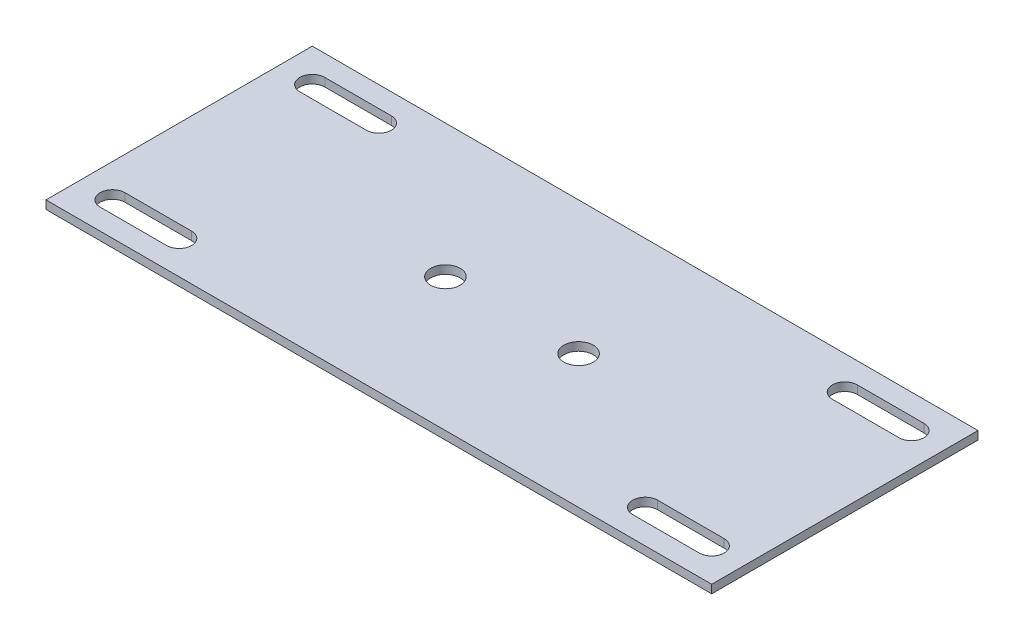
ISO-10303-21;
HEADER;
FILE_DESCRIPTION(('STEP AP214'),'2;1');
FILE_NAME('part.step','',(''),(''),'','','');
FILE_SCHEMA(('AUTOMOTIVE_DESIGN { 1 0 10303 214 1 1 1 1 }'));
ENDSEC;
DATA;
#1=APPLICATION_CONTEXT('core data for automotive mechanical design processes');
#2=APPLICATION_PROTOCOL_DEFINITION('international standard','automotive_design',2000,#1);
#3=PRODUCT_CONTEXT('',#1,'mechanical');
#4=PRODUCT('Part','Part','',(#3));
#5=PRODUCT_RELATED_PRODUCT_CATEGORY('part','',(#4));
#6=PRODUCT_DEFINITION_FORMATION('','',#4);
#7=PRODUCT_DEFINITION_CONTEXT('part definition',#1,'design');
#8=PRODUCT_DEFINITION('design','',#6,#7);
#9=PRODUCT_DEFINITION_SHAPE('','',#8);
#10=(LENGTH_UNIT() NAMED_UNIT(*) SI_UNIT(.MILLI.,.METRE.));
#11=(NAMED_UNIT(*) PLANE_ANGLE_UNIT() SI_UNIT($,.RADIAN.));
#12=(NAMED_UNIT(*) SI_UNIT($,.STERADIAN.) SOLID_ANGLE_UNIT());
#13=UNCERTAINTY_MEASURE_WITH_UNIT(LENGTH_MEASURE(1.E-05),#10,'distance_accuracy_value','');
#14=(GEOMETRIC_REPRESENTATION_CONTEXT(3) GLOBAL_UNCERTAINTY_ASSIGNED_CONTEXT((#13)) GLOBAL_UNIT_ASSIGNED_CONTEXT((#10,
#11,#12)) REPRESENTATION_CONTEXT('',''));
#15=CARTESIAN_POINT('',(0.,0.,0.));
#16=DIRECTION('',(0.,0.,1.));
#17=DIRECTION('',(1.,0.,0.));
#18=AXIS2_PLACEMENT_3D('',#15,#16,#17);
#19=CARTESIAN_POINT('',(63.5,1.5875,25.4));
#20=DIRECTION('',(-1.,0.,0.));
#21=DIRECTION('',(0.,0.,1.));
#22=AXIS2_PLACEMENT_3D('',#19,#20,#21);
#23=PLANE('',#22);
#24=DIRECTION('',(0.,0.,-1.));
#25=VECTOR('',#24,1.);
#26=CARTESIAN_POINT('',(63.5,0.,25.4));
#27=LINE('',#26,#25);
#28=CARTESIAN_POINT('',(63.5,0.,25.4));
#29=VERTEX_POINT('',#28);
#30=CARTESIAN_POINT('',(63.5,0.,-25.4));
#31=VERTEX_POINT('',#30);
#32=EDGE_CURVE('E302',#29,#31,#27,.T.);
#33=ORIENTED_EDGE('',*,*,#32,.T.);
#34=DIRECTION('',(0.,-1.,0.));
#35=VECTOR('',#34,1.);
#36=CARTESIAN_POINT('',(63.5,1.5875,-25.4));
#37=LINE('',#36,#35);
#38=CARTESIAN_POINT('',(63.5,1.5875,-25.4));
#39=VERTEX_POINT('',#38);
#40=EDGE_CURVE('E11',#39,#31,#37,.T.);
#41=ORIENTED_EDGE('',*,*,#40,.F.);
#42=DIRECTION('',(0.,0.,-1.));
#43=VECTOR('',#42,1.);
#44=CARTESIAN_POINT('',(63.5,1.5875,25.4));
#45=LINE('',#44,#43);
#46=CARTESIAN_POINT('',(63.5,1.5875,25.4));
#47=VERTEX_POINT('',#46);
#48=EDGE_CURVE('E309',#47,#39,#45,.T.);
#49=ORIENTED_EDGE('',*,*,#48,.F.);
#50=DIRECTION('',(0.,-1.,0.));
#51=VECTOR('',#50,1.);
#52=CARTESIAN_POINT('',(63.5,1.5875,25.4));
#53=LINE('',#52,#51);
#54=EDGE_CURVE('E319',#47,#29,#53,.T.);
#55=ORIENTED_EDGE('',*,*,#54,.T.);
#56=EDGE_LOOP('',(#33,#41,#49,#55));
#57=FACE_BOUND('',#56,.T.);
#58=ADVANCED_FACE('F37',(#57),#23,.F.);
#59=CARTESIAN_POINT('',(-63.5,1.5875,-25.4));
#60=DIRECTION('',(0.,0.,1.));
#61=DIRECTION('',(1.,0.,0.));
#62=AXIS2_PLACEMENT_3D('',#59,#60,#61);
#63=PLANE('',#62);
#64=DIRECTION('',(-1.,0.,0.));
#65=VECTOR('',#64,1.);
#66=CARTESIAN_POINT('',(-63.5,0.,-25.4));
#67=LINE('',#66,#65);
#68=CARTESIAN_POINT('',(-63.5,0.,-25.4));
#69=VERTEX_POINT('',#68);
#70=EDGE_CURVE('E322',#31,#69,#67,.T.);
#71=ORIENTED_EDGE('',*,*,#70,.T.);
#72=DIRECTION('',(0.,-1.,0.));
#73=VECTOR('',#72,1.);
#74=CARTESIAN_POINT('',(-63.5,1.5875,-25.4));
#75=LINE('',#74,#73);
#76=CARTESIAN_POINT('',(-63.5,1.5875,-25.4));
#77=VERTEX_POINT('',#76);
#78=EDGE_CURVE('E44',#77,#69,#75,.T.);
#79=ORIENTED_EDGE('',*,*,#78,.F.);
#80=DIRECTION('',(-1.,0.,0.));
#81=VECTOR('',#80,1.);
#82=CARTESIAN_POINT('',(-63.5,1.5875,-25.4));
#83=LINE('',#82,#81);
#84=EDGE_CURVE('E312',#39,#77,#83,.T.);
#85=ORIENTED_EDGE('',*,*,#84,.F.);
#86=ORIENTED_EDGE('',*,*,#40,.T.);
#87=EDGE_LOOP('',(#71,#79,#85,#86));
#88=FACE_BOUND('',#87,.T.);
#89=ADVANCED_FACE('F351',(#88),#63,.F.);
#90=CARTESIAN_POINT('',(-63.5,1.5875,25.4));
#91=DIRECTION('',(1.,0.,0.));
#92=DIRECTION('',(0.,0.,-1.));
#93=AXIS2_PLACEMENT_3D('',#90,#91,#92);
#94=PLANE('',#93);
#95=DIRECTION('',(0.,0.,1.));
#96=VECTOR('',#95,1.);
#97=CARTESIAN_POINT('',(-63.5,0.,25.4));
#98=LINE('',#97,#96);
#99=CARTESIAN_POINT('',(-63.5,0.,25.4));
#100=VERTEX_POINT('',#99);
#101=EDGE_CURVE('E324',#69,#100,#98,.T.);
#102=ORIENTED_EDGE('',*,*,#101,.T.);
#103=DIRECTION('',(0.,-1.,0.));
#104=VECTOR('',#103,1.);
#105=CARTESIAN_POINT('',(-63.5,1.5875,25.4));
#106=LINE('',#105,#104);
#107=CARTESIAN_POINT('',(-63.5,1.5875,25.4));
#108=VERTEX_POINT('',#107);
#109=EDGE_CURVE('E329',#108,#100,#106,.T.);
#110=ORIENTED_EDGE('',*,*,#109,.F.);
#111=DIRECTION('',(0.,0.,1.));
#112=VECTOR('',#111,1.);
#113=CARTESIAN_POINT('',(-63.5,1.5875,25.4));
#114=LINE('',#113,#112);
#115=EDGE_CURVE('E315',#77,#108,#114,.T.);
#116=ORIENTED_EDGE('',*,*,#115,.F.);
#117=ORIENTED_EDGE('',*,*,#78,.T.);
#118=EDGE_LOOP('',(#102,#110,#116,#117));
#119=FACE_BOUND('',#118,.T.);
#120=ADVANCED_FACE('F336',(#119),#94,.F.);
#121=CARTESIAN_POINT('',(-63.5,1.5875,25.4));
#122=DIRECTION('',(0.,0.,-1.));
#123=DIRECTION('',(-1.,0.,0.));
#124=AXIS2_PLACEMENT_3D('',#121,#122,#123);
#125=PLANE('',#124);
#126=DIRECTION('',(1.,0.,0.));
#127=VECTOR('',#126,1.);
#128=CARTESIAN_POINT('',(-63.5,0.,25.4));
#129=LINE('',#128,#127);
#130=EDGE_CURVE('E313',#100,#29,#129,.T.);
#131=ORIENTED_EDGE('',*,*,#130,.T.);
#132=ORIENTED_EDGE('',*,*,#54,.F.);
#133=DIRECTION('',(1.,0.,0.));
#134=VECTOR('',#133,1.);
#135=CARTESIAN_POINT('',(-63.5,1.5875,25.4));
#136=LINE('',#135,#134);
#137=EDGE_CURVE('E317',#108,#47,#136,.T.);
#138=ORIENTED_EDGE('',*,*,#137,.F.);
#139=ORIENTED_EDGE('',*,*,#109,.T.);
#140=EDGE_LOOP('',(#131,#132,#138,#139));
#141=FACE_BOUND('',#140,.T.);
#142=ADVANCED_FACE('F344',(#141),#125,.F.);
#143=CARTESIAN_POINT('',(0.,1.5875,0.));
#144=DIRECTION('',(0.,-1.,0.));
#145=DIRECTION('',(0.,0.,-1.));
#146=AXIS2_PLACEMENT_3D('',#143,#144,#145);
#147=PLANE('',#146);
#148=CARTESIAN_POINT('',(-12.7,1.5875,0.));
#149=DIRECTION('',(0.,1.,0.));
#150=DIRECTION('',(0.,0.,1.));
#151=AXIS2_PLACEMENT_3D('',#148,#149,#150);
#152=CIRCLE('',#151,2.8067);
#153=CARTESIAN_POINT('',(-12.7,1.5875,2.8067));
#154=VERTEX_POINT('',#153);
#155=EDGE_CURVE('E441',#154,#154,#152,.T.);
#156=ORIENTED_EDGE('',*,*,#155,.F.);
#157=EDGE_LOOP('',(#156));
#158=FACE_BOUND('',#157,.T.);
#159=CARTESIAN_POINT('',(12.7,1.5875,0.));
#160=DIRECTION('',(0.,1.,0.));
#161=DIRECTION('',(0.,0.,1.));
#162=AXIS2_PLACEMENT_3D('',#159,#160,#161);
#163=CIRCLE('',#162,2.8067);
#164=CARTESIAN_POINT('',(12.7,1.5875,2.8067));
#165=VERTEX_POINT('',#164);
#166=EDGE_CURVE('E443',#165,#165,#163,.T.);
#167=ORIENTED_EDGE('',*,*,#166,.F.);
#168=EDGE_LOOP('',(#167));
#169=FACE_BOUND('',#168,.T.);
#170=DIRECTION('',(1.,0.,0.));
#171=VECTOR('',#170,1.);
#172=CARTESIAN_POINT('',(44.45,1.5875,21.43125));
#173=LINE('',#172,#171);
#174=CARTESIAN_POINT('',(44.45,1.5875,21.43125));
#175=VERTEX_POINT('',#174);
#176=CARTESIAN_POINT('',(57.15,1.5875,21.43125));
#177=VERTEX_POINT('',#176);
#178=EDGE_CURVE('E203',#175,#177,#173,.T.);
#179=ORIENTED_EDGE('',*,*,#178,.F.);
#180=CARTESIAN_POINT('',(44.45,1.5875,19.05));
#181=DIRECTION('',(0.,1.,0.));
#182=DIRECTION('',(0.,0.,1.));
#183=AXIS2_PLACEMENT_3D('',#180,#181,#182);
#184=CIRCLE('',#183,2.38125);
#185=CARTESIAN_POINT('',(44.45,1.5875,16.66875));
#186=VERTEX_POINT('',#185);
#187=EDGE_CURVE('E51',#186,#175,#184,.T.);
#188=ORIENTED_EDGE('',*,*,#187,.F.);
#189=DIRECTION('',(-1.,0.,0.));
#190=VECTOR('',#189,1.);
#191=CARTESIAN_POINT('',(44.45,1.5875,16.66875));
#192=LINE('',#191,#190);
#193=CARTESIAN_POINT('',(57.15,1.5875,16.66875));
#194=VERTEX_POINT('',#193);
#195=EDGE_CURVE('E191',#194,#186,#192,.T.);
#196=ORIENTED_EDGE('',*,*,#195,.F.);
#197=CARTESIAN_POINT('',(57.15,1.5875,19.05));
#198=DIRECTION('',(0.,1.,0.));
#199=DIRECTION('',(0.,0.,1.));
#200=AXIS2_PLACEMENT_3D('',#197,#198,#199);
#201=CIRCLE('',#200,2.38125);
#202=EDGE_CURVE('E194',#177,#194,#201,.T.);
#203=ORIENTED_EDGE('',*,*,#202,.F.);
#204=EDGE_LOOP('',(#179,#188,#196,#203));
#205=FACE_BOUND('',#204,.T.);
#206=DIRECTION('',(1.,0.,0.));
#207=VECTOR('',#206,1.);
#208=CARTESIAN_POINT('',(44.45,1.5875,-16.66875));
#209=LINE('',#208,#207);
#210=CARTESIAN_POINT('',(44.45,1.5875,-16.66875));
#211=VERTEX_POINT('',#210);
#212=CARTESIAN_POINT('',(57.15,1.5875,-16.66875));
#213=VERTEX_POINT('',#212);
#214=EDGE_CURVE('E228',#211,#213,#209,.T.);
#215=ORIENTED_EDGE('',*,*,#214,.F.);
#216=CARTESIAN_POINT('',(44.45,1.5875,-19.05));
#217=DIRECTION('',(0.,1.,0.));
#218=DIRECTION('',(0.,0.,1.));
#219=AXIS2_PLACEMENT_3D('',#216,#217,#218);
#220=CIRCLE('',#219,2.38125);
#221=CARTESIAN_POINT('',(44.45,1.5875,-21.43125));
#222=VERTEX_POINT('',#221);
#223=EDGE_CURVE('E209',#222,#211,#220,.T.);
#224=ORIENTED_EDGE('',*,*,#223,.F.);
#225=DIRECTION('',(-1.,0.,0.));
#226=VECTOR('',#225,1.);
#227=CARTESIAN_POINT('',(44.45,1.5875,-21.43125));
#228=LINE('',#227,#226);
#229=CARTESIAN_POINT('',(57.15,1.5875,-21.43125));
#230=VERTEX_POINT('',#229);
#231=EDGE_CURVE('E217',#230,#222,#228,.T.);
#232=ORIENTED_EDGE('',*,*,#231,.F.);
#233=CARTESIAN_POINT('',(57.15,1.5875,-19.05));
#234=DIRECTION('',(0.,1.,0.));
#235=DIRECTION('',(0.,0.,1.));
#236=AXIS2_PLACEMENT_3D('',#233,#234,#235);
#237=CIRCLE('',#236,2.38125);
#238=EDGE_CURVE('E231',#213,#230,#237,.T.);
#239=ORIENTED_EDGE('',*,*,#238,.F.);
#240=EDGE_LOOP('',(#215,#224,#232,#239));
#241=FACE_BOUND('',#240,.T.);
#242=DIRECTION('',(1.,0.,0.));
#243=VECTOR('',#242,1.);
#244=CARTESIAN_POINT('',(-57.15,1.5875,21.43125));
#245=LINE('',#244,#243);
#246=CARTESIAN_POINT('',(-57.15,1.5875,21.43125));
#247=VERTEX_POINT('',#246);
#248=CARTESIAN_POINT('',(-44.45,1.5875,21.43125));
#249=VERTEX_POINT('',#248);
#250=EDGE_CURVE('E260',#247,#249,#245,.T.);
#251=ORIENTED_EDGE('',*,*,#250,.F.);
#252=CARTESIAN_POINT('',(-57.15,1.5875,19.05));
#253=DIRECTION('',(0.,1.,0.));
#254=DIRECTION('',(0.,0.,1.));
#255=AXIS2_PLACEMENT_3D('',#252,#253,#254);
#256=CIRCLE('',#255,2.38125);
#257=CARTESIAN_POINT('',(-57.15,1.5875,16.66875));
#258=VERTEX_POINT('',#257);
#259=EDGE_CURVE('E238',#258,#247,#256,.T.);
#260=ORIENTED_EDGE('',*,*,#259,.F.);
#261=DIRECTION('',(-1.,0.,0.));
#262=VECTOR('',#261,1.);
#263=CARTESIAN_POINT('',(-57.15,1.5875,16.66875));
#264=LINE('',#263,#262);
#265=CARTESIAN_POINT('',(-44.45,1.5875,16.66875));
#266=VERTEX_POINT('',#265);
#267=EDGE_CURVE('E249',#266,#258,#264,.T.);
#268=ORIENTED_EDGE('',*,*,#267,.F.);
#269=CARTESIAN_POINT('',(-44.45,1.5875,19.05));
#270=DIRECTION('',(0.,1.,0.));
#271=DIRECTION('',(0.,0.,1.));
#272=AXIS2_PLACEMENT_3D('',#269,#270,#271);
#273=CIRCLE('',#272,2.38125);
#274=EDGE_CURVE('E263',#249,#266,#273,.T.);
#275=ORIENTED_EDGE('',*,*,#274,.F.);
#276=EDGE_LOOP('',(#251,#260,#268,#275));
#277=FACE_BOUND('',#276,.T.);
#278=DIRECTION('',(1.,0.,0.));
#279=VECTOR('',#278,1.);
#280=CARTESIAN_POINT('',(-57.15,1.5875,-16.66875));
#281=LINE('',#280,#279);
#282=CARTESIAN_POINT('',(-57.15,1.5875,-16.66875));
#283=VERTEX_POINT('',#282);
#284=CARTESIAN_POINT('',(-44.45,1.5875,-16.66875));
#285=VERTEX_POINT('',#284);
#286=EDGE_CURVE('E292',#283,#285,#281,.T.);
#287=ORIENTED_EDGE('',*,*,#286,.F.);
#288=CARTESIAN_POINT('',(-57.15,1.5875,-19.05));
#289=DIRECTION('',(0.,1.,0.));
#290=DIRECTION('',(0.,0.,1.));
#291=AXIS2_PLACEMENT_3D('',#288,#289,#290);
#292=CIRCLE('',#291,2.38125);
#293=CARTESIAN_POINT('',(-57.15,1.5875,-21.43125));
#294=VERTEX_POINT('',#293);
#295=EDGE_CURVE('E270',#294,#283,#292,.T.);
#296=ORIENTED_EDGE('',*,*,#295,.F.);
#297=DIRECTION('',(-1.,0.,0.));
#298=VECTOR('',#297,1.);
#299=CARTESIAN_POINT('',(-57.15,1.5875,-21.43125));
#300=LINE('',#299,#298);
#301=CARTESIAN_POINT('',(-44.45,1.5875,-21.43125));
#302=VERTEX_POINT('',#301);
#303=EDGE_CURVE('E281',#302,#294,#300,.T.);
#304=ORIENTED_EDGE('',*,*,#303,.F.);
#305=CARTESIAN_POINT('',(-44.45,1.5875,-19.05));
#306=DIRECTION('',(0.,1.,0.));
#307=DIRECTION('',(0.,0.,1.));
#308=AXIS2_PLACEMENT_3D('',#305,#306,#307);
#309=CIRCLE('',#308,2.38125);
#310=EDGE_CURVE('E295',#285,#302,#309,.T.);
#311=ORIENTED_EDGE('',*,*,#310,.F.);
#312=EDGE_LOOP('',(#287,#296,#304,#311));
#313=FACE_BOUND('',#312,.T.);
#314=ORIENTED_EDGE('',*,*,#48,.T.);
#315=ORIENTED_EDGE('',*,*,#84,.T.);
#316=ORIENTED_EDGE('',*,*,#115,.T.);
#317=ORIENTED_EDGE('',*,*,#137,.T.);
#318=EDGE_LOOP('',(#314,#315,#316,#317));
#319=FACE_BOUND('',#318,.T.);
#320=ADVANCED_FACE('F350',(#158,#169,#205,#241,#277,#313,#319),#147,.F.);
#321=CARTESIAN_POINT('',(0.,0.,0.));
#322=DIRECTION('',(0.,-1.,0.));
#323=DIRECTION('',(0.,0.,-1.));
#324=AXIS2_PLACEMENT_3D('',#321,#322,#323);
#325=PLANE('',#324);
#326=CARTESIAN_POINT('',(-12.7,0.,0.));
#327=DIRECTION('',(0.,1.,0.));
#328=DIRECTION('',(0.,0.,1.));
#329=AXIS2_PLACEMENT_3D('',#326,#327,#328);
#330=CIRCLE('',#329,2.8067);
#331=CARTESIAN_POINT('',(-12.7,0.,2.8067));
#332=VERTEX_POINT('',#331);
#333=EDGE_CURVE('E438',#332,#332,#330,.T.);
#334=ORIENTED_EDGE('',*,*,#333,.T.);
#335=EDGE_LOOP('',(#334));
#336=FACE_BOUND('',#335,.T.);
#337=CARTESIAN_POINT('',(12.7,0.,0.));
#338=DIRECTION('',(0.,1.,0.));
#339=DIRECTION('',(0.,0.,1.));
#340=AXIS2_PLACEMENT_3D('',#337,#338,#339);
#341=CIRCLE('',#340,2.8067);
#342=CARTESIAN_POINT('',(12.7,0.,2.8067));
#343=VERTEX_POINT('',#342);
#344=EDGE_CURVE('E197',#343,#343,#341,.T.);
#345=ORIENTED_EDGE('',*,*,#344,.T.);
#346=EDGE_LOOP('',(#345));
#347=FACE_BOUND('',#346,.T.);
#348=CARTESIAN_POINT('',(44.45,0.,19.05));
#349=DIRECTION('',(0.,1.,0.));
#350=DIRECTION('',(0.,0.,1.));
#351=AXIS2_PLACEMENT_3D('',#348,#349,#350);
#352=CIRCLE('',#351,2.38125);
#353=CARTESIAN_POINT('',(44.45,0.,16.66875));
#354=VERTEX_POINT('',#353);
#355=CARTESIAN_POINT('',(44.45,0.,21.43125));
#356=VERTEX_POINT('',#355);
#357=EDGE_CURVE('E175',#354,#356,#352,.T.);
#358=ORIENTED_EDGE('',*,*,#357,.T.);
#359=DIRECTION('',(1.,0.,0.));
#360=VECTOR('',#359,1.);
#361=CARTESIAN_POINT('',(44.45,0.,21.43125));
#362=LINE('',#361,#360);
#363=CARTESIAN_POINT('',(57.15,0.,21.43125));
#364=VERTEX_POINT('',#363);
#365=EDGE_CURVE('E184',#356,#364,#362,.T.);
#366=ORIENTED_EDGE('',*,*,#365,.T.);
#367=CARTESIAN_POINT('',(57.15,0.,19.05));
#368=DIRECTION('',(0.,1.,0.));
#369=DIRECTION('',(0.,0.,1.));
#370=AXIS2_PLACEMENT_3D('',#367,#368,#369);
#371=CIRCLE('',#370,2.38125);
#372=CARTESIAN_POINT('',(57.15,0.,16.66875));
#373=VERTEX_POINT('',#372);
#374=EDGE_CURVE('E59',#364,#373,#371,.T.);
#375=ORIENTED_EDGE('',*,*,#374,.T.);
#376=DIRECTION('',(-1.,0.,0.));
#377=VECTOR('',#376,1.);
#378=CARTESIAN_POINT('',(44.45,0.,16.66875));
#379=LINE('',#378,#377);
#380=EDGE_CURVE('E181',#373,#354,#379,.T.);
#381=ORIENTED_EDGE('',*,*,#380,.T.);
#382=EDGE_LOOP('',(#358,#366,#375,#381));
#383=FACE_BOUND('',#382,.T.);
#384=CARTESIAN_POINT('',(44.45,0.,-19.05));
#385=DIRECTION('',(0.,1.,0.));
#386=DIRECTION('',(0.,0.,1.));
#387=AXIS2_PLACEMENT_3D('',#384,#385,#386);
#388=CIRCLE('',#387,2.38125);
#389=CARTESIAN_POINT('',(44.45,0.,-21.43125));
#390=VERTEX_POINT('',#389);
#391=CARTESIAN_POINT('',(44.45,0.,-16.66875));
#392=VERTEX_POINT('',#391);
#393=EDGE_CURVE('E213',#390,#392,#388,.T.);
#394=ORIENTED_EDGE('',*,*,#393,.T.);
#395=DIRECTION('',(1.,0.,0.));
#396=VECTOR('',#395,1.);
#397=CARTESIAN_POINT('',(44.45,0.,-16.66875));
#398=LINE('',#397,#396);
#399=CARTESIAN_POINT('',(57.15,0.,-16.66875));
#400=VERTEX_POINT('',#399);
#401=EDGE_CURVE('E216',#392,#400,#398,.T.);
#402=ORIENTED_EDGE('',*,*,#401,.T.);
#403=CARTESIAN_POINT('',(57.15,0.,-19.05));
#404=DIRECTION('',(0.,1.,0.));
#405=DIRECTION('',(0.,0.,1.));
#406=AXIS2_PLACEMENT_3D('',#403,#404,#405);
#407=CIRCLE('',#406,2.38125);
#408=CARTESIAN_POINT('',(57.15,0.,-21.43125));
#409=VERTEX_POINT('',#408);
#410=EDGE_CURVE('E220',#400,#409,#407,.T.);
#411=ORIENTED_EDGE('',*,*,#410,.T.);
#412=DIRECTION('',(-1.,0.,0.));
#413=VECTOR('',#412,1.);
#414=CARTESIAN_POINT('',(44.45,0.,-21.43125));
#415=LINE('',#414,#413);
#416=EDGE_CURVE('E223',#409,#390,#415,.T.);
#417=ORIENTED_EDGE('',*,*,#416,.T.);
#418=EDGE_LOOP('',(#394,#402,#411,#417));
#419=FACE_BOUND('',#418,.T.);
#420=CARTESIAN_POINT('',(-57.15,0.,19.05));
#421=DIRECTION('',(0.,1.,0.));
#422=DIRECTION('',(0.,0.,1.));
#423=AXIS2_PLACEMENT_3D('',#420,#421,#422);
#424=CIRCLE('',#423,2.38125);
#425=CARTESIAN_POINT('',(-57.15,0.,16.66875));
#426=VERTEX_POINT('',#425);
#427=CARTESIAN_POINT('',(-57.15,0.,21.43125));
#428=VERTEX_POINT('',#427);
#429=EDGE_CURVE('E245',#426,#428,#424,.T.);
#430=ORIENTED_EDGE('',*,*,#429,.T.);
#431=DIRECTION('',(1.,0.,0.));
#432=VECTOR('',#431,1.);
#433=CARTESIAN_POINT('',(-57.15,0.,21.43125));
#434=LINE('',#433,#432);
#435=CARTESIAN_POINT('',(-44.45,0.,21.43125));
#436=VERTEX_POINT('',#435);
#437=EDGE_CURVE('E248',#428,#436,#434,.T.);
#438=ORIENTED_EDGE('',*,*,#437,.T.);
#439=CARTESIAN_POINT('',(-44.45,0.,19.05));
#440=DIRECTION('',(0.,1.,0.));
#441=DIRECTION('',(0.,0.,1.));
#442=AXIS2_PLACEMENT_3D('',#439,#440,#441);
#443=CIRCLE('',#442,2.38125);
#444=CARTESIAN_POINT('',(-44.45,0.,16.66875));
#445=VERTEX_POINT('',#444);
#446=EDGE_CURVE('E252',#436,#445,#443,.T.);
#447=ORIENTED_EDGE('',*,*,#446,.T.);
#448=DIRECTION('',(-1.,0.,0.));
#449=VECTOR('',#448,1.);
#450=CARTESIAN_POINT('',(-57.15,0.,16.66875));
#451=LINE('',#450,#449);
#452=EDGE_CURVE('E255',#445,#426,#451,.T.);
#453=ORIENTED_EDGE('',*,*,#452,.T.);
#454=EDGE_LOOP('',(#430,#438,#447,#453));
#455=FACE_BOUND('',#454,.T.);
#456=CARTESIAN_POINT('',(-57.15,0.,-19.05));
#457=DIRECTION('',(0.,1.,0.));
#458=DIRECTION('',(0.,0.,1.));
#459=AXIS2_PLACEMENT_3D('',#456,#457,#458);
#460=CIRCLE('',#459,2.38125);
#461=CARTESIAN_POINT('',(-57.15,0.,-21.43125));
#462=VERTEX_POINT('',#461);
#463=CARTESIAN_POINT('',(-57.15,0.,-16.66875));
#464=VERTEX_POINT('',#463);
#465=EDGE_CURVE('E277',#462,#464,#460,.T.);
#466=ORIENTED_EDGE('',*,*,#465,.T.);
#467=DIRECTION('',(1.,0.,0.));
#468=VECTOR('',#467,1.);
#469=CARTESIAN_POINT('',(-57.15,0.,-16.66875));
#470=LINE('',#469,#468);
#471=CARTESIAN_POINT('',(-44.45,0.,-16.66875));
#472=VERTEX_POINT('',#471);
#473=EDGE_CURVE('E280',#464,#472,#470,.T.);
#474=ORIENTED_EDGE('',*,*,#473,.T.);
#475=CARTESIAN_POINT('',(-44.45,0.,-19.05));
#476=DIRECTION('',(0.,1.,0.));
#477=DIRECTION('',(0.,0.,1.));
#478=AXIS2_PLACEMENT_3D('',#475,#476,#477);
#479=CIRCLE('',#478,2.38125);
#480=CARTESIAN_POINT('',(-44.45,0.,-21.43125));
#481=VERTEX_POINT('',#480);
#482=EDGE_CURVE('E284',#472,#481,#479,.T.);
#483=ORIENTED_EDGE('',*,*,#482,.T.);
#484=DIRECTION('',(-1.,0.,0.));
#485=VECTOR('',#484,1.);
#486=CARTESIAN_POINT('',(-57.15,0.,-21.43125));
#487=LINE('',#486,#485);
#488=EDGE_CURVE('E287',#481,#462,#487,.T.);
#489=ORIENTED_EDGE('',*,*,#488,.T.);
#490=EDGE_LOOP('',(#466,#474,#483,#489));
#491=FACE_BOUND('',#490,.T.);
#492=ORIENTED_EDGE('',*,*,#32,.F.);
#493=ORIENTED_EDGE('',*,*,#130,.F.);
#494=ORIENTED_EDGE('',*,*,#101,.F.);
#495=ORIENTED_EDGE('',*,*,#70,.F.);
#496=EDGE_LOOP('',(#492,#493,#494,#495));
#497=FACE_BOUND('',#496,.T.);
#498=ADVANCED_FACE('F188',(#336,#347,#383,#419,#455,#491,#497),#325,.T.);
#499=CARTESIAN_POINT('',(-57.15,0.,-19.05));
#500=DIRECTION('',(0.,1.,0.));
#501=DIRECTION('',(0.,0.,1.));
#502=AXIS2_PLACEMENT_3D('',#499,#500,#501);
#503=CYLINDRICAL_SURFACE('',#502,2.38125);
#504=ORIENTED_EDGE('',*,*,#295,.T.);
#505=DIRECTION('',(0.,1.,0.));
#506=VECTOR('',#505,1.);
#507=CARTESIAN_POINT('',(-57.15,0.,-16.66875));
#508=LINE('',#507,#506);
#509=EDGE_CURVE('E290',#464,#283,#508,.T.);
#510=ORIENTED_EDGE('',*,*,#509,.F.);
#511=ORIENTED_EDGE('',*,*,#465,.F.);
#512=DIRECTION('',(0.,1.,0.));
#513=VECTOR('',#512,1.);
#514=CARTESIAN_POINT('',(-57.15,0.,-21.43125));
#515=LINE('',#514,#513);
#516=EDGE_CURVE('E300',#462,#294,#515,.T.);
#517=ORIENTED_EDGE('',*,*,#516,.T.);
#518=EDGE_LOOP('',(#504,#510,#511,#517));
#519=FACE_BOUND('',#518,.T.);
#520=ADVANCED_FACE('F363',(#519),#503,.F.);
#521=CARTESIAN_POINT('',(-57.15,0.,-21.43125));
#522=DIRECTION('',(0.,0.,-1.));
#523=DIRECTION('',(-1.,0.,0.));
#524=AXIS2_PLACEMENT_3D('',#521,#522,#523);
#525=PLANE('',#524);
#526=ORIENTED_EDGE('',*,*,#303,.T.);
#527=ORIENTED_EDGE('',*,*,#516,.F.);
#528=ORIENTED_EDGE('',*,*,#488,.F.);
#529=DIRECTION('',(0.,1.,0.));
#530=VECTOR('',#529,1.);
#531=CARTESIAN_POINT('',(-44.45,0.,-21.43125));
#532=LINE('',#531,#530);
#533=EDGE_CURVE('E303',#481,#302,#532,.T.);
#534=ORIENTED_EDGE('',*,*,#533,.T.);
#535=EDGE_LOOP('',(#526,#527,#528,#534));
#536=FACE_BOUND('',#535,.T.);
#537=ADVANCED_FACE('F370',(#536),#525,.F.);
#538=CARTESIAN_POINT('',(-44.45,0.,-19.05));
#539=DIRECTION('',(0.,1.,0.));
#540=DIRECTION('',(0.,0.,1.));
#541=AXIS2_PLACEMENT_3D('',#538,#539,#540);
#542=CYLINDRICAL_SURFACE('',#541,2.38125);
#543=ORIENTED_EDGE('',*,*,#310,.T.);
#544=ORIENTED_EDGE('',*,*,#533,.F.);
#545=ORIENTED_EDGE('',*,*,#482,.F.);
#546=DIRECTION('',(0.,1.,0.));
#547=VECTOR('',#546,1.);
#548=CARTESIAN_POINT('',(-44.45,0.,-16.66875));
#549=LINE('',#548,#547);
#550=EDGE_CURVE('E305',#472,#285,#549,.T.);
#551=ORIENTED_EDGE('',*,*,#550,.T.);
#552=EDGE_LOOP('',(#543,#544,#545,#551));
#553=FACE_BOUND('',#552,.T.);
#554=ADVANCED_FACE('F376',(#553),#542,.F.);
#555=CARTESIAN_POINT('',(-57.15,0.,-16.66875));
#556=DIRECTION('',(0.,0.,1.));
#557=DIRECTION('',(1.,0.,0.));
#558=AXIS2_PLACEMENT_3D('',#555,#556,#557);
#559=PLANE('',#558);
#560=ORIENTED_EDGE('',*,*,#286,.T.);
#561=ORIENTED_EDGE('',*,*,#550,.F.);
#562=ORIENTED_EDGE('',*,*,#473,.F.);
#563=ORIENTED_EDGE('',*,*,#509,.T.);
#564=EDGE_LOOP('',(#560,#561,#562,#563));
#565=FACE_BOUND('',#564,.T.);
#566=ADVANCED_FACE('F372',(#565),#559,.F.);
#567=CARTESIAN_POINT('',(-57.15,0.,19.05));
#568=DIRECTION('',(0.,1.,0.));
#569=DIRECTION('',(0.,0.,1.));
#570=AXIS2_PLACEMENT_3D('',#567,#568,#569);
#571=CYLINDRICAL_SURFACE('',#570,2.38125);
#572=ORIENTED_EDGE('',*,*,#259,.T.);
#573=DIRECTION('',(0.,1.,0.));
#574=VECTOR('',#573,1.);
#575=CARTESIAN_POINT('',(-57.15,0.,21.43125));
#576=LINE('',#575,#574);
#577=EDGE_CURVE('E258',#428,#247,#576,.T.);
#578=ORIENTED_EDGE('',*,*,#577,.F.);
#579=ORIENTED_EDGE('',*,*,#429,.F.);
#580=DIRECTION('',(0.,1.,0.));
#581=VECTOR('',#580,1.);
#582=CARTESIAN_POINT('',(-57.15,0.,16.66875));
#583=LINE('',#582,#581);
#584=EDGE_CURVE('E268',#426,#258,#583,.T.);
#585=ORIENTED_EDGE('',*,*,#584,.T.);
#586=EDGE_LOOP('',(#572,#578,#579,#585));
#587=FACE_BOUND('',#586,.T.);
#588=ADVANCED_FACE('F375',(#587),#571,.F.);
#589=CARTESIAN_POINT('',(-57.15,0.,16.66875));
#590=DIRECTION('',(0.,0.,-1.));
#591=DIRECTION('',(-1.,0.,0.));
#592=AXIS2_PLACEMENT_3D('',#589,#590,#591);
#593=PLANE('',#592);
#594=ORIENTED_EDGE('',*,*,#267,.T.);
#595=ORIENTED_EDGE('',*,*,#584,.F.);
#596=ORIENTED_EDGE('',*,*,#452,.F.);
#597=DIRECTION('',(0.,1.,0.));
#598=VECTOR('',#597,1.);
#599=CARTESIAN_POINT('',(-44.45,0.,16.66875));
#600=LINE('',#599,#598);
#601=EDGE_CURVE('E271',#445,#266,#600,.T.);
#602=ORIENTED_EDGE('',*,*,#601,.T.);
#603=EDGE_LOOP('',(#594,#595,#596,#602));
#604=FACE_BOUND('',#603,.T.);
#605=ADVANCED_FACE('F386',(#604),#593,.F.);
#606=CARTESIAN_POINT('',(-44.45,0.,19.05));
#607=DIRECTION('',(0.,1.,0.));
#608=DIRECTION('',(0.,0.,1.));
#609=AXIS2_PLACEMENT_3D('',#606,#607,#608);
#610=CYLINDRICAL_SURFACE('',#609,2.38125);
#611=ORIENTED_EDGE('',*,*,#274,.T.);
#612=ORIENTED_EDGE('',*,*,#601,.F.);
#613=ORIENTED_EDGE('',*,*,#446,.F.);
#614=DIRECTION('',(0.,1.,0.));
#615=VECTOR('',#614,1.);
#616=CARTESIAN_POINT('',(-44.45,0.,21.43125));
#617=LINE('',#616,#615);
#618=EDGE_CURVE('E273',#436,#249,#617,.T.);
#619=ORIENTED_EDGE('',*,*,#618,.T.);
#620=EDGE_LOOP('',(#611,#612,#613,#619));
#621=FACE_BOUND('',#620,.T.);
#622=ADVANCED_FACE('F392',(#621),#610,.F.);
#623=CARTESIAN_POINT('',(-57.15,0.,21.43125));
#624=DIRECTION('',(0.,0.,1.));
#625=DIRECTION('',(1.,0.,0.));
#626=AXIS2_PLACEMENT_3D('',#623,#624,#625);
#627=PLANE('',#626);
#628=ORIENTED_EDGE('',*,*,#250,.T.);
#629=ORIENTED_EDGE('',*,*,#618,.F.);
#630=ORIENTED_EDGE('',*,*,#437,.F.);
#631=ORIENTED_EDGE('',*,*,#577,.T.);
#632=EDGE_LOOP('',(#628,#629,#630,#631));
#633=FACE_BOUND('',#632,.T.);
#634=ADVANCED_FACE('F388',(#633),#627,.F.);
#635=CARTESIAN_POINT('',(44.45,0.,-19.05));
#636=DIRECTION('',(0.,1.,0.));
#637=DIRECTION('',(0.,0.,1.));
#638=AXIS2_PLACEMENT_3D('',#635,#636,#637);
#639=CYLINDRICAL_SURFACE('',#638,2.38125);
#640=ORIENTED_EDGE('',*,*,#223,.T.);
#641=DIRECTION('',(0.,1.,0.));
#642=VECTOR('',#641,1.);
#643=CARTESIAN_POINT('',(44.45,0.,-16.66875));
#644=LINE('',#643,#642);
#645=EDGE_CURVE('E226',#392,#211,#644,.T.);
#646=ORIENTED_EDGE('',*,*,#645,.F.);
#647=ORIENTED_EDGE('',*,*,#393,.F.);
#648=DIRECTION('',(0.,1.,0.));
#649=VECTOR('',#648,1.);
#650=CARTESIAN_POINT('',(44.45,0.,-21.43125));
#651=LINE('',#650,#649);
#652=EDGE_CURVE('E236',#390,#222,#651,.T.);
#653=ORIENTED_EDGE('',*,*,#652,.T.);
#654=EDGE_LOOP('',(#640,#646,#647,#653));
#655=FACE_BOUND('',#654,.T.);
#656=ADVANCED_FACE('F391',(#655),#639,.F.);
#657=CARTESIAN_POINT('',(44.45,0.,-21.43125));
#658=DIRECTION('',(0.,0.,-1.));
#659=DIRECTION('',(-1.,0.,0.));
#660=AXIS2_PLACEMENT_3D('',#657,#658,#659);
#661=PLANE('',#660);
#662=ORIENTED_EDGE('',*,*,#231,.T.);
#663=ORIENTED_EDGE('',*,*,#652,.F.);
#664=ORIENTED_EDGE('',*,*,#416,.F.);
#665=DIRECTION('',(0.,1.,0.));
#666=VECTOR('',#665,1.);
#667=CARTESIAN_POINT('',(57.15,0.,-21.43125));
#668=LINE('',#667,#666);
#669=EDGE_CURVE('E239',#409,#230,#668,.T.);
#670=ORIENTED_EDGE('',*,*,#669,.T.);
#671=EDGE_LOOP('',(#662,#663,#664,#670));
#672=FACE_BOUND('',#671,.T.);
#673=ADVANCED_FACE('F402',(#672),#661,.F.);
#674=CARTESIAN_POINT('',(57.15,0.,-19.05));
#675=DIRECTION('',(0.,1.,0.));
#676=DIRECTION('',(0.,0.,1.));
#677=AXIS2_PLACEMENT_3D('',#674,#675,#676);
#678=CYLINDRICAL_SURFACE('',#677,2.38125);
#679=ORIENTED_EDGE('',*,*,#238,.T.);
#680=ORIENTED_EDGE('',*,*,#669,.F.);
#681=ORIENTED_EDGE('',*,*,#410,.F.);
#682=DIRECTION('',(0.,1.,0.));
#683=VECTOR('',#682,1.);
#684=CARTESIAN_POINT('',(57.15,0.,-16.66875));
#685=LINE('',#684,#683);
#686=EDGE_CURVE('E241',#400,#213,#685,.T.);
#687=ORIENTED_EDGE('',*,*,#686,.T.);
#688=EDGE_LOOP('',(#679,#680,#681,#687));
#689=FACE_BOUND('',#688,.T.);
#690=ADVANCED_FACE('F407',(#689),#678,.F.);
#691=CARTESIAN_POINT('',(44.45,0.,-16.66875));
#692=DIRECTION('',(0.,0.,1.));
#693=DIRECTION('',(1.,0.,0.));
#694=AXIS2_PLACEMENT_3D('',#691,#692,#693);
#695=PLANE('',#694);
#696=ORIENTED_EDGE('',*,*,#214,.T.);
#697=ORIENTED_EDGE('',*,*,#686,.F.);
#698=ORIENTED_EDGE('',*,*,#401,.F.);
#699=ORIENTED_EDGE('',*,*,#645,.T.);
#700=EDGE_LOOP('',(#696,#697,#698,#699));
#701=FACE_BOUND('',#700,.T.);
#702=ADVANCED_FACE('F404',(#701),#695,.F.);
#703=CARTESIAN_POINT('',(44.45,0.,19.05));
#704=DIRECTION('',(0.,1.,0.));
#705=DIRECTION('',(0.,0.,1.));
#706=AXIS2_PLACEMENT_3D('',#703,#704,#705);
#707=CYLINDRICAL_SURFACE('',#706,2.38125);
#708=ORIENTED_EDGE('',*,*,#187,.T.);
#709=DIRECTION('',(0.,1.,0.));
#710=VECTOR('',#709,1.);
#711=CARTESIAN_POINT('',(44.45,0.,21.43125));
#712=LINE('',#711,#710);
#713=EDGE_CURVE('E171',#356,#175,#712,.T.);
#714=ORIENTED_EDGE('',*,*,#713,.F.);
#715=ORIENTED_EDGE('',*,*,#357,.F.);
#716=DIRECTION('',(0.,1.,0.));
#717=VECTOR('',#716,1.);
#718=CARTESIAN_POINT('',(44.45,0.,16.66875));
#719=LINE('',#718,#717);
#720=EDGE_CURVE('E207',#354,#186,#719,.T.);
#721=ORIENTED_EDGE('',*,*,#720,.T.);
#722=EDGE_LOOP('',(#708,#714,#715,#721));
#723=FACE_BOUND('',#722,.T.);
#724=ADVANCED_FACE('F173',(#723),#707,.F.);
#725=CARTESIAN_POINT('',(44.45,0.,16.66875));
#726=DIRECTION('',(0.,0.,-1.));
#727=DIRECTION('',(-1.,0.,0.));
#728=AXIS2_PLACEMENT_3D('',#725,#726,#727);
#729=PLANE('',#728);
#730=ORIENTED_EDGE('',*,*,#195,.T.);
#731=ORIENTED_EDGE('',*,*,#720,.F.);
#732=ORIENTED_EDGE('',*,*,#380,.F.);
#733=DIRECTION('',(0.,1.,0.));
#734=VECTOR('',#733,1.);
#735=CARTESIAN_POINT('',(57.15,0.,16.66875));
#736=LINE('',#735,#734);
#737=EDGE_CURVE('E210',#373,#194,#736,.T.);
#738=ORIENTED_EDGE('',*,*,#737,.T.);
#739=EDGE_LOOP('',(#730,#731,#732,#738));
#740=FACE_BOUND('',#739,.T.);
#741=ADVANCED_FACE('F417',(#740),#729,.F.);
#742=CARTESIAN_POINT('',(57.15,0.,19.05));
#743=DIRECTION('',(0.,1.,0.));
#744=DIRECTION('',(0.,0.,1.));
#745=AXIS2_PLACEMENT_3D('',#742,#743,#744);
#746=CYLINDRICAL_SURFACE('',#745,2.38125);
#747=ORIENTED_EDGE('',*,*,#202,.T.);
#748=ORIENTED_EDGE('',*,*,#737,.F.);
#749=ORIENTED_EDGE('',*,*,#374,.F.);
#750=DIRECTION('',(0.,1.,0.));
#751=VECTOR('',#750,1.);
#752=CARTESIAN_POINT('',(57.15,0.,21.43125));
#753=LINE('',#752,#751);
#754=EDGE_CURVE('E180',#364,#177,#753,.T.);
#755=ORIENTED_EDGE('',*,*,#754,.T.);
#756=EDGE_LOOP('',(#747,#748,#749,#755));
#757=FACE_BOUND('',#756,.T.);
#758=ADVANCED_FACE('F421',(#757),#746,.F.);
#759=CARTESIAN_POINT('',(44.45,0.,21.43125));
#760=DIRECTION('',(0.,0.,1.));
#761=DIRECTION('',(1.,0.,0.));
#762=AXIS2_PLACEMENT_3D('',#759,#760,#761);
#763=PLANE('',#762);
#764=ORIENTED_EDGE('',*,*,#178,.T.);
#765=ORIENTED_EDGE('',*,*,#754,.F.);
#766=ORIENTED_EDGE('',*,*,#365,.F.);
#767=ORIENTED_EDGE('',*,*,#713,.T.);
#768=EDGE_LOOP('',(#764,#765,#766,#767));
#769=FACE_BOUND('',#768,.T.);
#770=ADVANCED_FACE('F185',(#769),#763,.F.);
#771=CARTESIAN_POINT('',(12.7,1.5875,0.));
#772=DIRECTION('',(0.,1.,0.));
#773=DIRECTION('',(0.,0.,1.));
#774=AXIS2_PLACEMENT_3D('',#771,#772,#773);
#775=CYLINDRICAL_SURFACE('',#774,2.8067);
#776=ORIENTED_EDGE('',*,*,#344,.F.);
#777=EDGE_LOOP('',(#776));
#778=FACE_BOUND('',#777,.T.);
#779=ORIENTED_EDGE('',*,*,#166,.T.);
#780=EDGE_LOOP('',(#779));
#781=FACE_BOUND('',#780,.T.);
#782=ADVANCED_FACE('F420',(#778,#781),#775,.F.);
#783=CARTESIAN_POINT('',(-12.7,1.5875,0.));
#784=DIRECTION('',(0.,1.,0.));
#785=DIRECTION('',(0.,0.,1.));
#786=AXIS2_PLACEMENT_3D('',#783,#784,#785);
#787=CYLINDRICAL_SURFACE('',#786,2.8067);
#788=ORIENTED_EDGE('',*,*,#333,.F.);
#789=EDGE_LOOP('',(#788));
#790=FACE_BOUND('',#789,.T.);
#791=ORIENTED_EDGE('',*,*,#155,.T.);
#792=EDGE_LOOP('',(#791));
#793=FACE_BOUND('',#792,.T.);
#794=ADVANCED_FACE('F429',(#790,#793),#787,.F.);
#795=CLOSED_SHELL('',(#58,#89,#120,#142,#320,#498,#520,#537,#554,#566,#588,#605,#622,#634,#656,
#673,#690,#702,#724,#741,#758,#770,#782,#794));
#796=MANIFOLD_SOLID_BREP('B2',#795);
#797=ADVANCED_BREP_SHAPE_REPRESENTATION('',(#18,#796),#14);
#798=SHAPE_DEFINITION_REPRESENTATION(#9,#797);
ENDSEC;
END-ISO-10303-21;
